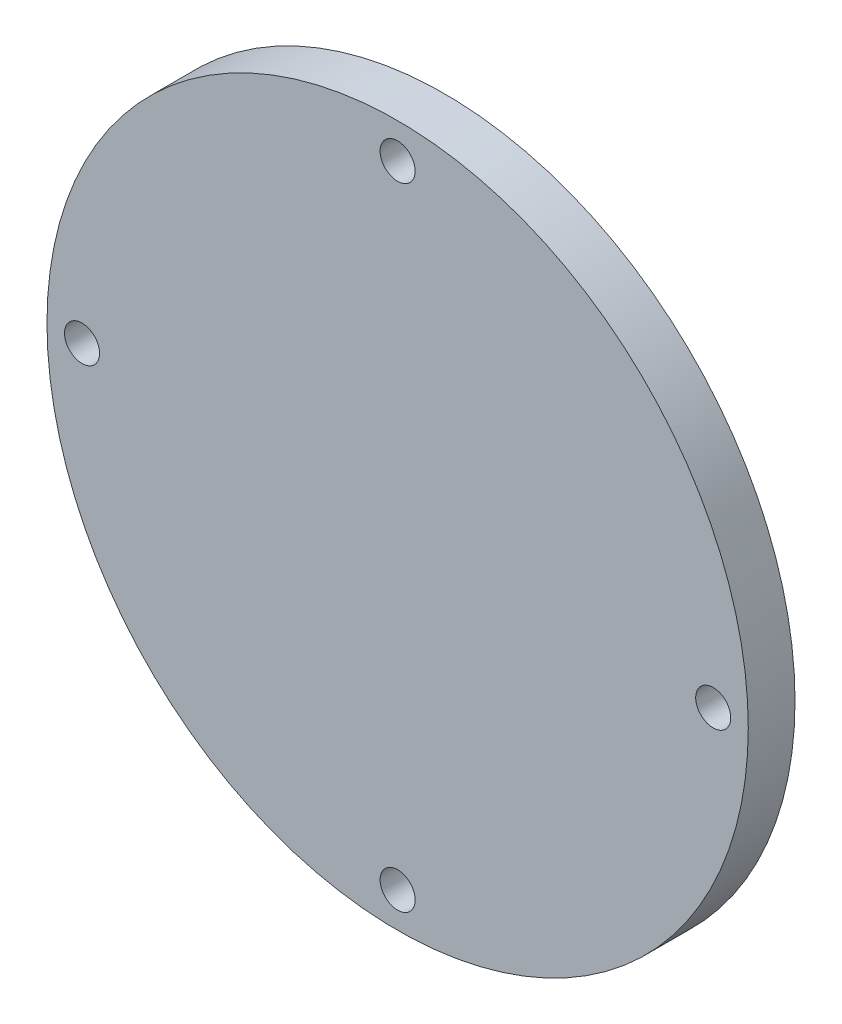
ISO-10303-21;
HEADER;
FILE_DESCRIPTION(('STEP AP214'),'2;1');
FILE_NAME('part.step','',(''),(''),'','','');
FILE_SCHEMA(('AUTOMOTIVE_DESIGN { 1 0 10303 214 1 1 1 1 }'));
ENDSEC;
DATA;
#1=APPLICATION_CONTEXT('core data for automotive mechanical design processes');
#2=APPLICATION_PROTOCOL_DEFINITION('international standard','automotive_design',2000,#1);
#3=PRODUCT_CONTEXT('',#1,'mechanical');
#4=PRODUCT('Part','Part','',(#3));
#5=PRODUCT_RELATED_PRODUCT_CATEGORY('part','',(#4));
#6=PRODUCT_DEFINITION_FORMATION('','',#4);
#7=PRODUCT_DEFINITION_CONTEXT('part definition',#1,'design');
#8=PRODUCT_DEFINITION('design','',#6,#7);
#9=PRODUCT_DEFINITION_SHAPE('','',#8);
#10=(LENGTH_UNIT() NAMED_UNIT(*) SI_UNIT(.MILLI.,.METRE.));
#11=(NAMED_UNIT(*) PLANE_ANGLE_UNIT() SI_UNIT($,.RADIAN.));
#12=(NAMED_UNIT(*) SI_UNIT($,.STERADIAN.) SOLID_ANGLE_UNIT());
#13=UNCERTAINTY_MEASURE_WITH_UNIT(LENGTH_MEASURE(1.E-05),#10,'distance_accuracy_value','');
#14=(GEOMETRIC_REPRESENTATION_CONTEXT(3) GLOBAL_UNCERTAINTY_ASSIGNED_CONTEXT((#13)) GLOBAL_UNIT_ASSIGNED_CONTEXT((#10,
#11,#12)) REPRESENTATION_CONTEXT('',''));
#15=CARTESIAN_POINT('',(0.,0.,0.));
#16=DIRECTION('',(0.,0.,1.));
#17=DIRECTION('',(1.,0.,0.));
#18=AXIS2_PLACEMENT_3D('',#15,#16,#17);
#19=CARTESIAN_POINT('',(0.,0.,4.));
#20=DIRECTION('',(0.,0.,-1.));
#21=DIRECTION('',(-1.,0.,0.));
#22=AXIS2_PLACEMENT_3D('',#19,#20,#21);
#23=CYLINDRICAL_SURFACE('',#22,30.);
#24=CARTESIAN_POINT('',(0.,0.,4.));
#25=DIRECTION('',(0.,0.,1.));
#26=DIRECTION('',(1.,0.,0.));
#27=AXIS2_PLACEMENT_3D('',#24,#25,#26);
#28=CIRCLE('',#27,30.);
#29=CARTESIAN_POINT('',(30.,0.,4.));
#30=VERTEX_POINT('',#29);
#31=EDGE_CURVE('E44',#30,#30,#28,.T.);
#32=ORIENTED_EDGE('',*,*,#31,.F.);
#33=EDGE_LOOP('',(#32));
#34=FACE_BOUND('',#33,.T.);
#35=CARTESIAN_POINT('',(0.,0.,0.));
#36=DIRECTION('',(0.,0.,1.));
#37=DIRECTION('',(1.,0.,0.));
#38=AXIS2_PLACEMENT_3D('',#35,#36,#37);
#39=CIRCLE('',#38,30.);
#40=CARTESIAN_POINT('',(30.,0.,0.));
#41=VERTEX_POINT('',#40);
#42=EDGE_CURVE('E49',#41,#41,#39,.T.);
#43=ORIENTED_EDGE('',*,*,#42,.T.);
#44=EDGE_LOOP('',(#43));
#45=FACE_BOUND('',#44,.T.);
#46=ADVANCED_FACE('F37',(#34,#45),#23,.T.);
#47=CARTESIAN_POINT('',(0.,0.,4.));
#48=DIRECTION('',(0.,0.,1.));
#49=DIRECTION('',(1.,0.,0.));
#50=AXIS2_PLACEMENT_3D('',#47,#48,#49);
#51=PLANE('',#50);
#52=CARTESIAN_POINT('',(-27.,0.,4.));
#53=DIRECTION('',(0.,0.,1.));
#54=DIRECTION('',(0.,1.,0.));
#55=AXIS2_PLACEMENT_3D('',#52,#53,#54);
#56=CIRCLE('',#55,1.5);
#57=CARTESIAN_POINT('',(-27.,1.49999999999991,4.));
#58=VERTEX_POINT('',#57);
#59=EDGE_CURVE('E69',#58,#58,#56,.T.);
#60=ORIENTED_EDGE('',*,*,#59,.F.);
#61=EDGE_LOOP('',(#60));
#62=FACE_BOUND('',#61,.T.);
#63=CARTESIAN_POINT('',(0.,-27.,4.));
#64=DIRECTION('',(0.,0.,1.));
#65=DIRECTION('',(-1.,0.,0.));
#66=AXIS2_PLACEMENT_3D('',#63,#64,#65);
#67=CIRCLE('',#66,1.5);
#68=CARTESIAN_POINT('',(-1.5,-27.,4.));
#69=VERTEX_POINT('',#68);
#70=EDGE_CURVE('E148',#69,#69,#67,.T.);
#71=ORIENTED_EDGE('',*,*,#70,.F.);
#72=EDGE_LOOP('',(#71));
#73=FACE_BOUND('',#72,.T.);
#74=CARTESIAN_POINT('',(27.,2.82809988446294E-13,4.));
#75=DIRECTION('',(0.,0.,1.));
#76=DIRECTION('',(0.,-1.,0.));
#77=AXIS2_PLACEMENT_3D('',#74,#75,#76);
#78=CIRCLE('',#77,1.5);
#79=CARTESIAN_POINT('',(27.,-1.49999999999972,4.));
#80=VERTEX_POINT('',#79);
#81=EDGE_CURVE('E144',#80,#80,#78,.T.);
#82=ORIENTED_EDGE('',*,*,#81,.F.);
#83=EDGE_LOOP('',(#82));
#84=FACE_BOUND('',#83,.T.);
#85=CARTESIAN_POINT('',(0.,27.,4.));
#86=DIRECTION('',(0.,0.,1.));
#87=DIRECTION('',(1.,0.,0.));
#88=AXIS2_PLACEMENT_3D('',#85,#86,#87);
#89=CIRCLE('',#88,1.5);
#90=CARTESIAN_POINT('',(1.5,27.,4.));
#91=VERTEX_POINT('',#90);
#92=EDGE_CURVE('E58',#91,#91,#89,.T.);
#93=ORIENTED_EDGE('',*,*,#92,.F.);
#94=EDGE_LOOP('',(#93));
#95=FACE_BOUND('',#94,.T.);
#96=ORIENTED_EDGE('',*,*,#31,.T.);
#97=EDGE_LOOP('',(#96));
#98=FACE_BOUND('',#97,.T.);
#99=ADVANCED_FACE('F84',(#62,#73,#84,#95,#98),#51,.T.);
#100=CARTESIAN_POINT('',(0.,0.,0.));
#101=DIRECTION('',(0.,0.,1.));
#102=DIRECTION('',(1.,0.,0.));
#103=AXIS2_PLACEMENT_3D('',#100,#101,#102);
#104=PLANE('',#103);
#105=CARTESIAN_POINT('',(0.,0.,0.));
#106=DIRECTION('',(0.,0.,1.));
#107=DIRECTION('',(1.,0.,0.));
#108=AXIS2_PLACEMENT_3D('',#105,#106,#107);
#109=CIRCLE('',#108,16.);
#110=CARTESIAN_POINT('',(16.,0.,0.));
#111=VERTEX_POINT('',#110);
#112=EDGE_CURVE('E10',#111,#111,#109,.F.);
#113=ORIENTED_EDGE('',*,*,#112,.F.);
#114=EDGE_LOOP('',(#113));
#115=FACE_BOUND('',#114,.T.);
#116=CARTESIAN_POINT('',(-27.,0.,0.));
#117=DIRECTION('',(0.,0.,1.));
#118=DIRECTION('',(1.,0.,0.));
#119=AXIS2_PLACEMENT_3D('',#116,#117,#118);
#120=CIRCLE('',#119,1.5);
#121=CARTESIAN_POINT('',(-25.5,0.,0.));
#122=VERTEX_POINT('',#121);
#123=EDGE_CURVE('E72',#122,#122,#120,.T.);
#124=ORIENTED_EDGE('',*,*,#123,.T.);
#125=EDGE_LOOP('',(#124));
#126=FACE_BOUND('',#125,.T.);
#127=CARTESIAN_POINT('',(0.,-27.,0.));
#128=DIRECTION('',(0.,0.,1.));
#129=DIRECTION('',(1.,0.,0.));
#130=AXIS2_PLACEMENT_3D('',#127,#128,#129);
#131=CIRCLE('',#130,1.5);
#132=CARTESIAN_POINT('',(1.5,-27.,0.));
#133=VERTEX_POINT('',#132);
#134=EDGE_CURVE('E68',#133,#133,#131,.T.);
#135=ORIENTED_EDGE('',*,*,#134,.T.);
#136=EDGE_LOOP('',(#135));
#137=FACE_BOUND('',#136,.T.);
#138=CARTESIAN_POINT('',(27.,2.82809988446294E-13,0.));
#139=DIRECTION('',(0.,0.,1.));
#140=DIRECTION('',(1.,0.,0.));
#141=AXIS2_PLACEMENT_3D('',#138,#139,#140);
#142=CIRCLE('',#141,1.5);
#143=CARTESIAN_POINT('',(28.5,2.82809988446294E-13,0.));
#144=VERTEX_POINT('',#143);
#145=EDGE_CURVE('E64',#144,#144,#142,.T.);
#146=ORIENTED_EDGE('',*,*,#145,.T.);
#147=EDGE_LOOP('',(#146));
#148=FACE_BOUND('',#147,.T.);
#149=CARTESIAN_POINT('',(0.,27.,0.));
#150=DIRECTION('',(0.,0.,1.));
#151=DIRECTION('',(1.,0.,0.));
#152=AXIS2_PLACEMENT_3D('',#149,#150,#151);
#153=CIRCLE('',#152,1.5);
#154=CARTESIAN_POINT('',(1.5,27.,0.));
#155=VERTEX_POINT('',#154);
#156=EDGE_CURVE('E55',#155,#155,#153,.T.);
#157=ORIENTED_EDGE('',*,*,#156,.T.);
#158=EDGE_LOOP('',(#157));
#159=FACE_BOUND('',#158,.T.);
#160=ORIENTED_EDGE('',*,*,#42,.F.);
#161=EDGE_LOOP('',(#160));
#162=FACE_BOUND('',#161,.T.);
#163=ADVANCED_FACE('F86',(#115,#126,#137,#148,#159,#162),#104,.F.);
#164=CARTESIAN_POINT('',(0.,27.,-6.));
#165=DIRECTION('',(0.,0.,1.));
#166=DIRECTION('',(1.,0.,0.));
#167=AXIS2_PLACEMENT_3D('',#164,#165,#166);
#168=CYLINDRICAL_SURFACE('',#167,1.5);
#169=ORIENTED_EDGE('',*,*,#92,.T.);
#170=EDGE_LOOP('',(#169));
#171=FACE_BOUND('',#170,.T.);
#172=ORIENTED_EDGE('',*,*,#156,.F.);
#173=EDGE_LOOP('',(#172));
#174=FACE_BOUND('',#173,.T.);
#175=ADVANCED_FACE('F81',(#171,#174),#168,.F.);
#176=CARTESIAN_POINT('',(27.,2.82809988446294E-13,-6.));
#177=DIRECTION('',(0.,0.,1.));
#178=DIRECTION('',(1.,0.,0.));
#179=AXIS2_PLACEMENT_3D('',#176,#177,#178);
#180=CYLINDRICAL_SURFACE('',#179,1.5);
#181=ORIENTED_EDGE('',*,*,#81,.T.);
#182=EDGE_LOOP('',(#181));
#183=FACE_BOUND('',#182,.T.);
#184=ORIENTED_EDGE('',*,*,#145,.F.);
#185=EDGE_LOOP('',(#184));
#186=FACE_BOUND('',#185,.T.);
#187=ADVANCED_FACE('F101',(#183,#186),#180,.F.);
#188=CARTESIAN_POINT('',(0.,-27.,-6.));
#189=DIRECTION('',(0.,0.,1.));
#190=DIRECTION('',(1.,0.,0.));
#191=AXIS2_PLACEMENT_3D('',#188,#189,#190);
#192=CYLINDRICAL_SURFACE('',#191,1.5);
#193=ORIENTED_EDGE('',*,*,#70,.T.);
#194=EDGE_LOOP('',(#193));
#195=FACE_BOUND('',#194,.T.);
#196=ORIENTED_EDGE('',*,*,#134,.F.);
#197=EDGE_LOOP('',(#196));
#198=FACE_BOUND('',#197,.T.);
#199=ADVANCED_FACE('F104',(#195,#198),#192,.F.);
#200=CARTESIAN_POINT('',(-27.,0.,-6.));
#201=DIRECTION('',(0.,0.,1.));
#202=DIRECTION('',(1.,0.,0.));
#203=AXIS2_PLACEMENT_3D('',#200,#201,#202);
#204=CYLINDRICAL_SURFACE('',#203,1.5);
#205=ORIENTED_EDGE('',*,*,#59,.T.);
#206=EDGE_LOOP('',(#205));
#207=FACE_BOUND('',#206,.T.);
#208=ORIENTED_EDGE('',*,*,#123,.F.);
#209=EDGE_LOOP('',(#208));
#210=FACE_BOUND('',#209,.T.);
#211=ADVANCED_FACE('F108',(#207,#210),#204,.F.);
#212=CARTESIAN_POINT('',(0.,0.,-6.));
#213=DIRECTION('',(0.,0.,-1.));
#214=DIRECTION('',(-1.,0.,0.));
#215=AXIS2_PLACEMENT_3D('',#212,#213,#214);
#216=PLANE('',#215);
#217=CARTESIAN_POINT('',(0.,0.,-6.));
#218=DIRECTION('',(0.,0.,-1.));
#219=DIRECTION('',(-1.,0.,0.));
#220=AXIS2_PLACEMENT_3D('',#217,#218,#219);
#221=CIRCLE('',#220,16.);
#222=CARTESIAN_POINT('',(-16.,0.,-6.));
#223=VERTEX_POINT('',#222);
#224=EDGE_CURVE('E138',#223,#223,#221,.T.);
#225=ORIENTED_EDGE('',*,*,#224,.T.);
#226=EDGE_LOOP('',(#225));
#227=FACE_BOUND('',#226,.T.);
#228=CARTESIAN_POINT('',(0.,0.,-6.));
#229=DIRECTION('',(0.,0.,-1.));
#230=DIRECTION('',(-1.,0.,0.));
#231=AXIS2_PLACEMENT_3D('',#228,#229,#230);
#232=CIRCLE('',#231,12.5);
#233=CARTESIAN_POINT('',(-12.5,0.,-6.));
#234=VERTEX_POINT('',#233);
#235=EDGE_CURVE('E131',#234,#234,#232,.T.);
#236=ORIENTED_EDGE('',*,*,#235,.F.);
#237=EDGE_LOOP('',(#236));
#238=FACE_BOUND('',#237,.T.);
#239=ADVANCED_FACE('F112',(#227,#238),#216,.T.);
#240=CARTESIAN_POINT('',(0.,0.,-6.));
#241=DIRECTION('',(0.,0.,1.));
#242=DIRECTION('',(1.,0.,0.));
#243=AXIS2_PLACEMENT_3D('',#240,#241,#242);
#244=CYLINDRICAL_SURFACE('',#243,16.);
#245=ORIENTED_EDGE('',*,*,#224,.F.);
#246=EDGE_LOOP('',(#245));
#247=FACE_BOUND('',#246,.T.);
#248=ORIENTED_EDGE('',*,*,#112,.T.);
#249=EDGE_LOOP('',(#248));
#250=FACE_BOUND('',#249,.T.);
#251=ADVANCED_FACE('F114',(#247,#250),#244,.T.);
#252=CARTESIAN_POINT('',(0.,0.,-6.));
#253=DIRECTION('',(0.,0.,1.));
#254=DIRECTION('',(1.,0.,0.));
#255=AXIS2_PLACEMENT_3D('',#252,#253,#254);
#256=CYLINDRICAL_SURFACE('',#255,12.5);
#257=ORIENTED_EDGE('',*,*,#235,.T.);
#258=EDGE_LOOP('',(#257));
#259=FACE_BOUND('',#258,.T.);
#260=CARTESIAN_POINT('',(0.,0.,0.));
#261=DIRECTION('',(0.,0.,-1.));
#262=DIRECTION('',(-1.,0.,0.));
#263=AXIS2_PLACEMENT_3D('',#260,#261,#262);
#264=CIRCLE('',#263,12.5);
#265=CARTESIAN_POINT('',(-12.5,0.,0.));
#266=VERTEX_POINT('',#265);
#267=EDGE_CURVE('E134',#266,#266,#264,.T.);
#268=ORIENTED_EDGE('',*,*,#267,.F.);
#269=EDGE_LOOP('',(#268));
#270=FACE_BOUND('',#269,.T.);
#271=ADVANCED_FACE('F117',(#259,#270),#256,.F.);
#272=ORIENTED_EDGE('',*,*,#267,.T.);
#273=EDGE_LOOP('',(#272));
#274=FACE_BOUND('',#273,.T.);
#275=ADVANCED_FACE('F94',(#274),#104,.F.);
#276=CLOSED_SHELL('',(#46,#99,#163,#175,#187,#199,#211,#239,#251,#271,#275));
#277=MANIFOLD_SOLID_BREP('B2',#276);
#278=ADVANCED_BREP_SHAPE_REPRESENTATION('',(#18,#277),#14);
#279=SHAPE_DEFINITION_REPRESENTATION(#9,#278);
ENDSEC;
END-ISO-10303-21;
